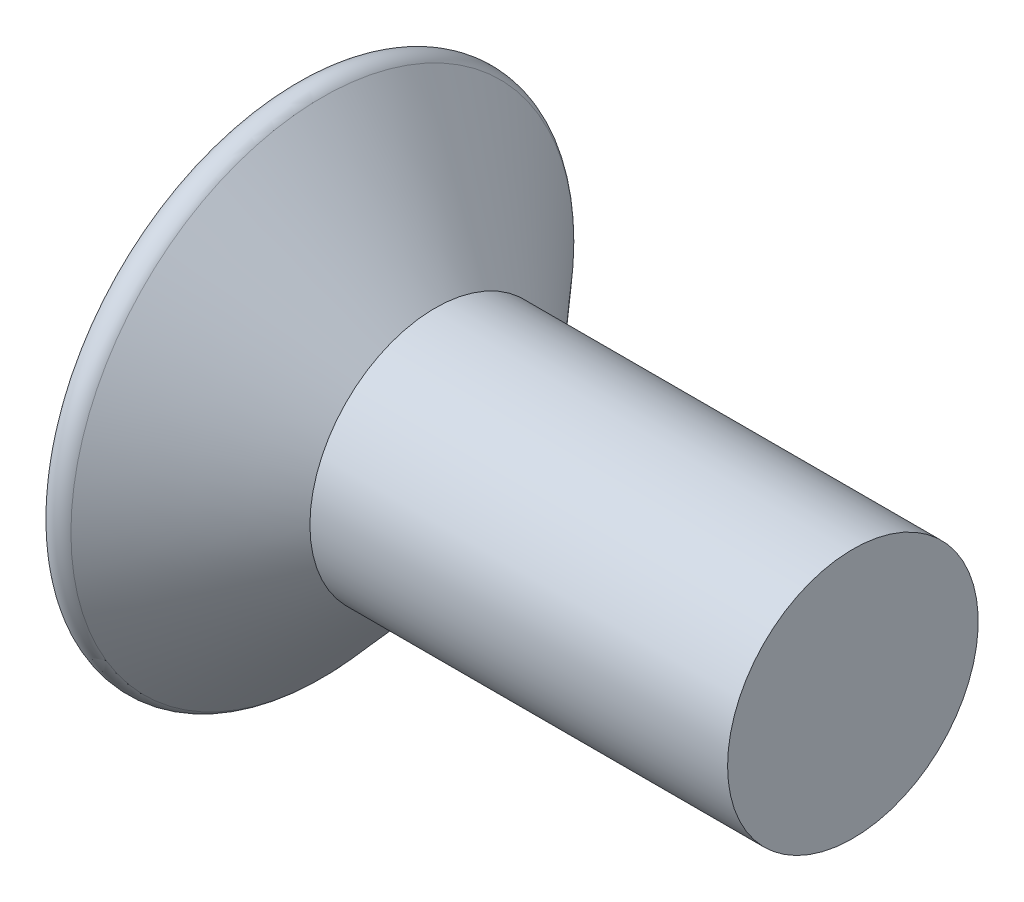
ISO-10303-21;
HEADER;
FILE_DESCRIPTION(('STEP AP214'),'2;1');
FILE_NAME('part.step','',(''),(''),'','','');
FILE_SCHEMA(('AUTOMOTIVE_DESIGN { 1 0 10303 214 1 1 1 1 }'));
ENDSEC;
DATA;
#1=APPLICATION_CONTEXT('core data for automotive mechanical design processes');
#2=APPLICATION_PROTOCOL_DEFINITION('international standard','automotive_design',2000,#1);
#3=PRODUCT_CONTEXT('',#1,'mechanical');
#4=PRODUCT('Part','Part','',(#3));
#5=PRODUCT_RELATED_PRODUCT_CATEGORY('part','',(#4));
#6=PRODUCT_DEFINITION_FORMATION('','',#4);
#7=PRODUCT_DEFINITION_CONTEXT('part definition',#1,'design');
#8=PRODUCT_DEFINITION('design','',#6,#7);
#9=PRODUCT_DEFINITION_SHAPE('','',#8);
#10=(LENGTH_UNIT() NAMED_UNIT(*) SI_UNIT(.MILLI.,.METRE.));
#11=(NAMED_UNIT(*) PLANE_ANGLE_UNIT() SI_UNIT($,.RADIAN.));
#12=(NAMED_UNIT(*) SI_UNIT($,.STERADIAN.) SOLID_ANGLE_UNIT());
#13=UNCERTAINTY_MEASURE_WITH_UNIT(LENGTH_MEASURE(1.E-05),#10,'distance_accuracy_value','');
#14=(GEOMETRIC_REPRESENTATION_CONTEXT(3) GLOBAL_UNCERTAINTY_ASSIGNED_CONTEXT((#13)) GLOBAL_UNIT_ASSIGNED_CONTEXT((#10,
#11,#12)) REPRESENTATION_CONTEXT('',''));
#15=CARTESIAN_POINT('',(0.,0.,0.));
#16=DIRECTION('',(0.,0.,1.));
#17=DIRECTION('',(1.,0.,0.));
#18=AXIS2_PLACEMENT_3D('',#15,#16,#17);
#19=CARTESIAN_POINT('',(0.,0.,0.));
#20=DIRECTION('',(1.,0.,0.));
#21=DIRECTION('',(0.,0.,-1.));
#22=AXIS2_PLACEMENT_3D('',#19,#20,#21);
#23=PLANE('',#22);
#24=DIRECTION('',(0.,0.866025403784439,0.5));
#25=VECTOR('',#24,1.);
#26=CARTESIAN_POINT('',(0.,-0.866025403784438,0.5));
#27=LINE('',#26,#25);
#28=CARTESIAN_POINT('',(0.,-0.866025403784438,0.5));
#29=VERTEX_POINT('',#28);
#30=CARTESIAN_POINT('',(0.,0.,1.));
#31=VERTEX_POINT('',#30);
#32=EDGE_CURVE('E135',#29,#31,#27,.T.);
#33=ORIENTED_EDGE('',*,*,#32,.F.);
#34=DIRECTION('',(0.,0.,1.));
#35=VECTOR('',#34,1.);
#36=CARTESIAN_POINT('',(0.,-0.866025403784438,-0.5));
#37=LINE('',#36,#35);
#38=CARTESIAN_POINT('',(0.,-0.866025403784438,-0.5));
#39=VERTEX_POINT('',#38);
#40=EDGE_CURVE('E55',#39,#29,#37,.T.);
#41=ORIENTED_EDGE('',*,*,#40,.F.);
#42=DIRECTION('',(0.,-0.866025403784439,0.5));
#43=VECTOR('',#42,1.);
#44=CARTESIAN_POINT('',(0.,0.,-1.));
#45=LINE('',#44,#43);
#46=CARTESIAN_POINT('',(0.,0.,-1.));
#47=VERTEX_POINT('',#46);
#48=EDGE_CURVE('E148',#47,#39,#45,.T.);
#49=ORIENTED_EDGE('',*,*,#48,.F.);
#50=DIRECTION('',(0.,-0.866025403784439,-0.5));
#51=VECTOR('',#50,1.);
#52=CARTESIAN_POINT('',(0.,0.866025403784439,-0.5));
#53=LINE('',#52,#51);
#54=CARTESIAN_POINT('',(0.,0.866025403784439,-0.5));
#55=VERTEX_POINT('',#54);
#56=EDGE_CURVE('E145',#55,#47,#53,.T.);
#57=ORIENTED_EDGE('',*,*,#56,.F.);
#58=DIRECTION('',(0.,0.,-1.));
#59=VECTOR('',#58,1.);
#60=CARTESIAN_POINT('',(0.,0.866025403784439,0.499999999999999));
#61=LINE('',#60,#59);
#62=CARTESIAN_POINT('',(0.,0.866025403784439,0.499999999999999));
#63=VERTEX_POINT('',#62);
#64=EDGE_CURVE('E103',#63,#55,#61,.T.);
#65=ORIENTED_EDGE('',*,*,#64,.F.);
#66=DIRECTION('',(0.,0.866025403784438,-0.5));
#67=VECTOR('',#66,1.);
#68=CARTESIAN_POINT('',(0.,0.,1.));
#69=LINE('',#68,#67);
#70=EDGE_CURVE('E139',#31,#63,#69,.T.);
#71=ORIENTED_EDGE('',*,*,#70,.F.);
#72=EDGE_LOOP('',(#33,#41,#49,#57,#65,#71));
#73=FACE_BOUND('',#72,.T.);
#74=CARTESIAN_POINT('',(0.,0.,0.));
#75=DIRECTION('',(1.,0.,0.));
#76=DIRECTION('',(0.,0.,-1.));
#77=AXIS2_PLACEMENT_3D('',#74,#75,#76);
#78=CIRCLE('',#77,2.87652826390631);
#79=CARTESIAN_POINT('',(0.,0.,-2.87652826390631));
#80=VERTEX_POINT('',#79);
#81=EDGE_CURVE('E48',#80,#80,#78,.F.);
#82=ORIENTED_EDGE('',*,*,#81,.T.);
#83=EDGE_LOOP('',(#82));
#84=FACE_BOUND('',#83,.T.);
#85=ADVANCED_FACE('F39',(#73,#84),#23,.F.);
#86=CARTESIAN_POINT('',(1.7,0.,0.));
#87=DIRECTION('',(-1.,0.,0.));
#88=DIRECTION('',(0.,0.,1.));
#89=AXIS2_PLACEMENT_3D('',#86,#87,#88);
#90=CONICAL_SURFACE('',#89,1.5,0.840896668643165);
#91=CARTESIAN_POINT('',(0.34904826270502,0.,0.));
#92=DIRECTION('',(1.,0.,0.));
#93=DIRECTION('',(0.,0.,-1.));
#94=AXIS2_PLACEMENT_3D('',#91,#92,#93);
#95=CIRCLE('',#94,3.00988723580027);
#96=CARTESIAN_POINT('',(0.34904826270502,0.,-3.00988723580027));
#97=VERTEX_POINT('',#96);
#98=EDGE_CURVE('E11',#97,#97,#95,.T.);
#99=ORIENTED_EDGE('',*,*,#98,.T.);
#100=EDGE_LOOP('',(#99));
#101=FACE_BOUND('',#100,.T.);
#102=CARTESIAN_POINT('',(1.7,0.,0.));
#103=DIRECTION('',(-1.,0.,0.));
#104=DIRECTION('',(0.,0.,1.));
#105=AXIS2_PLACEMENT_3D('',#102,#103,#104);
#106=CIRCLE('',#105,1.5);
#107=CARTESIAN_POINT('',(1.7,0.,1.5));
#108=VERTEX_POINT('',#107);
#109=EDGE_CURVE('E167',#108,#108,#106,.T.);
#110=ORIENTED_EDGE('',*,*,#109,.T.);
#111=EDGE_LOOP('',(#110));
#112=FACE_BOUND('',#111,.T.);
#113=ADVANCED_FACE('F190',(#101,#112),#90,.T.);
#114=CARTESIAN_POINT('',(0.,0.,0.));
#115=DIRECTION('',(-1.,0.,0.));
#116=DIRECTION('',(0.,0.,1.));
#117=AXIS2_PLACEMENT_3D('',#114,#115,#116);
#118=CYLINDRICAL_SURFACE('',#117,1.5);
#119=ORIENTED_EDGE('',*,*,#109,.F.);
#120=EDGE_LOOP('',(#119));
#121=FACE_BOUND('',#120,.T.);
#122=CARTESIAN_POINT('',(6.7,0.,0.));
#123=DIRECTION('',(-1.,0.,0.));
#124=DIRECTION('',(0.,0.,1.));
#125=AXIS2_PLACEMENT_3D('',#122,#123,#124);
#126=CIRCLE('',#125,1.5);
#127=CARTESIAN_POINT('',(6.7,0.,1.5));
#128=VERTEX_POINT('',#127);
#129=EDGE_CURVE('E154',#128,#128,#126,.T.);
#130=ORIENTED_EDGE('',*,*,#129,.T.);
#131=EDGE_LOOP('',(#130));
#132=FACE_BOUND('',#131,.T.);
#133=ADVANCED_FACE('F185',(#121,#132),#118,.T.);
#134=CARTESIAN_POINT('',(6.7,1.5,0.));
#135=DIRECTION('',(-1.,0.,0.));
#136=DIRECTION('',(0.,0.,1.));
#137=AXIS2_PLACEMENT_3D('',#134,#135,#136);
#138=PLANE('',#137);
#139=ORIENTED_EDGE('',*,*,#129,.F.);
#140=EDGE_LOOP('',(#139));
#141=FACE_BOUND('',#140,.T.);
#142=ADVANCED_FACE('F177',(#141),#138,.F.);
#143=CARTESIAN_POINT('',(0.2,0.,0.));
#144=DIRECTION('',(1.,0.,0.));
#145=DIRECTION('',(0.,0.,-1.));
#146=AXIS2_PLACEMENT_3D('',#143,#144,#145);
#147=TOROIDAL_SURFACE('',#146,2.87652826390631,0.2);
#148=ORIENTED_EDGE('',*,*,#98,.F.);
#149=EDGE_LOOP('',(#148));
#150=FACE_BOUND('',#149,.T.);
#151=ORIENTED_EDGE('',*,*,#81,.F.);
#152=EDGE_LOOP('',(#151));
#153=FACE_BOUND('',#152,.T.);
#154=ADVANCED_FACE('F41',(#150,#153),#147,.T.);
#155=CARTESIAN_POINT('',(0.2,-0.866025403784438,-0.5));
#156=DIRECTION('',(0.,-1.,0.));
#157=DIRECTION('',(0.,0.,-1.));
#158=AXIS2_PLACEMENT_3D('',#155,#156,#157);
#159=PLANE('',#158);
#160=ORIENTED_EDGE('',*,*,#40,.T.);
#161=DIRECTION('',(-1.,0.,0.));
#162=VECTOR('',#161,1.);
#163=CARTESIAN_POINT('',(0.2,-0.866025403784438,0.5));
#164=LINE('',#163,#162);
#165=CARTESIAN_POINT('',(0.2,-0.866025403784438,0.5));
#166=VERTEX_POINT('',#165);
#167=EDGE_CURVE('E85',#166,#29,#164,.T.);
#168=ORIENTED_EDGE('',*,*,#167,.F.);
#169=DIRECTION('',(0.,0.,1.));
#170=VECTOR('',#169,1.);
#171=CARTESIAN_POINT('',(0.2,-0.866025403784438,-0.5));
#172=LINE('',#171,#170);
#173=CARTESIAN_POINT('',(0.2,-0.866025403784438,-0.5));
#174=VERTEX_POINT('',#173);
#175=EDGE_CURVE('E151',#174,#166,#172,.T.);
#176=ORIENTED_EDGE('',*,*,#175,.F.);
#177=DIRECTION('',(-1.,0.,0.));
#178=VECTOR('',#177,1.);
#179=CARTESIAN_POINT('',(0.2,-0.866025403784438,-0.5));
#180=LINE('',#179,#178);
#181=EDGE_CURVE('E63',#174,#39,#180,.T.);
#182=ORIENTED_EDGE('',*,*,#181,.T.);
#183=EDGE_LOOP('',(#160,#168,#176,#182));
#184=FACE_BOUND('',#183,.T.);
#185=ADVANCED_FACE('F176',(#184),#159,.F.);
#186=CARTESIAN_POINT('',(0.2,0.,-1.));
#187=DIRECTION('',(0.,-0.5,-0.866025403784439));
#188=DIRECTION('',(0.,0.866025403784439,-0.5));
#189=AXIS2_PLACEMENT_3D('',#186,#187,#188);
#190=PLANE('',#189);
#191=ORIENTED_EDGE('',*,*,#48,.T.);
#192=ORIENTED_EDGE('',*,*,#181,.F.);
#193=DIRECTION('',(0.,-0.866025403784439,0.5));
#194=VECTOR('',#193,1.);
#195=CARTESIAN_POINT('',(0.2,0.,-1.));
#196=LINE('',#195,#194);
#197=CARTESIAN_POINT('',(0.2,0.,-1.));
#198=VERTEX_POINT('',#197);
#199=EDGE_CURVE('E117',#198,#174,#196,.T.);
#200=ORIENTED_EDGE('',*,*,#199,.F.);
#201=DIRECTION('',(-1.,0.,0.));
#202=VECTOR('',#201,1.);
#203=CARTESIAN_POINT('',(0.2,0.,-1.));
#204=LINE('',#203,#202);
#205=EDGE_CURVE('E108',#198,#47,#204,.T.);
#206=ORIENTED_EDGE('',*,*,#205,.T.);
#207=EDGE_LOOP('',(#191,#192,#200,#206));
#208=FACE_BOUND('',#207,.T.);
#209=ADVANCED_FACE('F183',(#208),#190,.F.);
#210=CARTESIAN_POINT('',(0.2,0.866025403784439,-0.5));
#211=DIRECTION('',(0.,0.5,-0.866025403784439));
#212=DIRECTION('',(0.,0.866025403784439,0.5));
#213=AXIS2_PLACEMENT_3D('',#210,#211,#212);
#214=PLANE('',#213);
#215=ORIENTED_EDGE('',*,*,#56,.T.);
#216=ORIENTED_EDGE('',*,*,#205,.F.);
#217=DIRECTION('',(0.,-0.866025403784439,-0.5));
#218=VECTOR('',#217,1.);
#219=CARTESIAN_POINT('',(0.2,0.866025403784439,-0.5));
#220=LINE('',#219,#218);
#221=CARTESIAN_POINT('',(0.2,0.866025403784439,-0.5));
#222=VERTEX_POINT('',#221);
#223=EDGE_CURVE('E112',#222,#198,#220,.T.);
#224=ORIENTED_EDGE('',*,*,#223,.F.);
#225=DIRECTION('',(-1.,0.,0.));
#226=VECTOR('',#225,1.);
#227=CARTESIAN_POINT('',(0.2,0.866025403784439,-0.5));
#228=LINE('',#227,#226);
#229=EDGE_CURVE('E96',#222,#55,#228,.T.);
#230=ORIENTED_EDGE('',*,*,#229,.T.);
#231=EDGE_LOOP('',(#215,#216,#224,#230));
#232=FACE_BOUND('',#231,.T.);
#233=ADVANCED_FACE('F113',(#232),#214,.F.);
#234=CARTESIAN_POINT('',(0.2,0.866025403784439,0.499999999999999));
#235=DIRECTION('',(0.,1.,0.));
#236=DIRECTION('',(0.,0.,1.));
#237=AXIS2_PLACEMENT_3D('',#234,#235,#236);
#238=PLANE('',#237);
#239=ORIENTED_EDGE('',*,*,#64,.T.);
#240=ORIENTED_EDGE('',*,*,#229,.F.);
#241=DIRECTION('',(0.,0.,-1.));
#242=VECTOR('',#241,1.);
#243=CARTESIAN_POINT('',(0.2,0.866025403784439,0.499999999999999));
#244=LINE('',#243,#242);
#245=CARTESIAN_POINT('',(0.2,0.866025403784439,0.499999999999999));
#246=VERTEX_POINT('',#245);
#247=EDGE_CURVE('E100',#246,#222,#244,.T.);
#248=ORIENTED_EDGE('',*,*,#247,.F.);
#249=DIRECTION('',(-1.,0.,0.));
#250=VECTOR('',#249,1.);
#251=CARTESIAN_POINT('',(0.2,0.866025403784439,0.499999999999999));
#252=LINE('',#251,#250);
#253=EDGE_CURVE('E109',#246,#63,#252,.T.);
#254=ORIENTED_EDGE('',*,*,#253,.T.);
#255=EDGE_LOOP('',(#239,#240,#248,#254));
#256=FACE_BOUND('',#255,.T.);
#257=ADVANCED_FACE('F98',(#256),#238,.F.);
#258=CARTESIAN_POINT('',(0.2,0.,1.));
#259=DIRECTION('',(0.,0.5,0.866025403784438));
#260=DIRECTION('',(0.,-0.866025403784439,0.5));
#261=AXIS2_PLACEMENT_3D('',#258,#259,#260);
#262=PLANE('',#261);
#263=ORIENTED_EDGE('',*,*,#70,.T.);
#264=ORIENTED_EDGE('',*,*,#253,.F.);
#265=DIRECTION('',(0.,0.866025403784438,-0.5));
#266=VECTOR('',#265,1.);
#267=CARTESIAN_POINT('',(0.2,0.,1.));
#268=LINE('',#267,#266);
#269=CARTESIAN_POINT('',(0.2,0.,1.));
#270=VERTEX_POINT('',#269);
#271=EDGE_CURVE('E123',#270,#246,#268,.T.);
#272=ORIENTED_EDGE('',*,*,#271,.F.);
#273=DIRECTION('',(-1.,0.,0.));
#274=VECTOR('',#273,1.);
#275=CARTESIAN_POINT('',(0.2,0.,1.));
#276=LINE('',#275,#274);
#277=EDGE_CURVE('E159',#270,#31,#276,.T.);
#278=ORIENTED_EDGE('',*,*,#277,.T.);
#279=EDGE_LOOP('',(#263,#264,#272,#278));
#280=FACE_BOUND('',#279,.T.);
#281=ADVANCED_FACE('F205',(#280),#262,.F.);
#282=CARTESIAN_POINT('',(0.2,-0.866025403784438,0.5));
#283=DIRECTION('',(0.,-0.5,0.866025403784439));
#284=DIRECTION('',(0.,-0.866025403784439,-0.5));
#285=AXIS2_PLACEMENT_3D('',#282,#283,#284);
#286=PLANE('',#285);
#287=ORIENTED_EDGE('',*,*,#32,.T.);
#288=ORIENTED_EDGE('',*,*,#277,.F.);
#289=DIRECTION('',(0.,0.866025403784439,0.5));
#290=VECTOR('',#289,1.);
#291=CARTESIAN_POINT('',(0.2,-0.866025403784438,0.5));
#292=LINE('',#291,#290);
#293=EDGE_CURVE('E127',#166,#270,#292,.T.);
#294=ORIENTED_EDGE('',*,*,#293,.F.);
#295=ORIENTED_EDGE('',*,*,#167,.T.);
#296=EDGE_LOOP('',(#287,#288,#294,#295));
#297=FACE_BOUND('',#296,.T.);
#298=ADVANCED_FACE('F202',(#297),#286,.F.);
#299=CARTESIAN_POINT('',(0.2,0.,0.));
#300=DIRECTION('',(-1.,0.,0.));
#301=DIRECTION('',(0.,0.,1.));
#302=AXIS2_PLACEMENT_3D('',#299,#300,#301);
#303=PLANE('',#302);
#304=ORIENTED_EDGE('',*,*,#175,.T.);
#305=ORIENTED_EDGE('',*,*,#293,.T.);
#306=ORIENTED_EDGE('',*,*,#271,.T.);
#307=ORIENTED_EDGE('',*,*,#247,.T.);
#308=ORIENTED_EDGE('',*,*,#223,.T.);
#309=ORIENTED_EDGE('',*,*,#199,.T.);
#310=EDGE_LOOP('',(#304,#305,#306,#307,#308,#309));
#311=FACE_BOUND('',#310,.T.);
#312=ADVANCED_FACE('F120',(#311),#303,.T.);
#313=CLOSED_SHELL('',(#85,#113,#133,#142,#154,#185,#209,#233,#257,#281,#298,#312));
#314=MANIFOLD_SOLID_BREP('B2',#313);
#315=ADVANCED_BREP_SHAPE_REPRESENTATION('',(#18,#314),#14);
#316=SHAPE_DEFINITION_REPRESENTATION(#9,#315);
ENDSEC;
END-ISO-10303-21;
